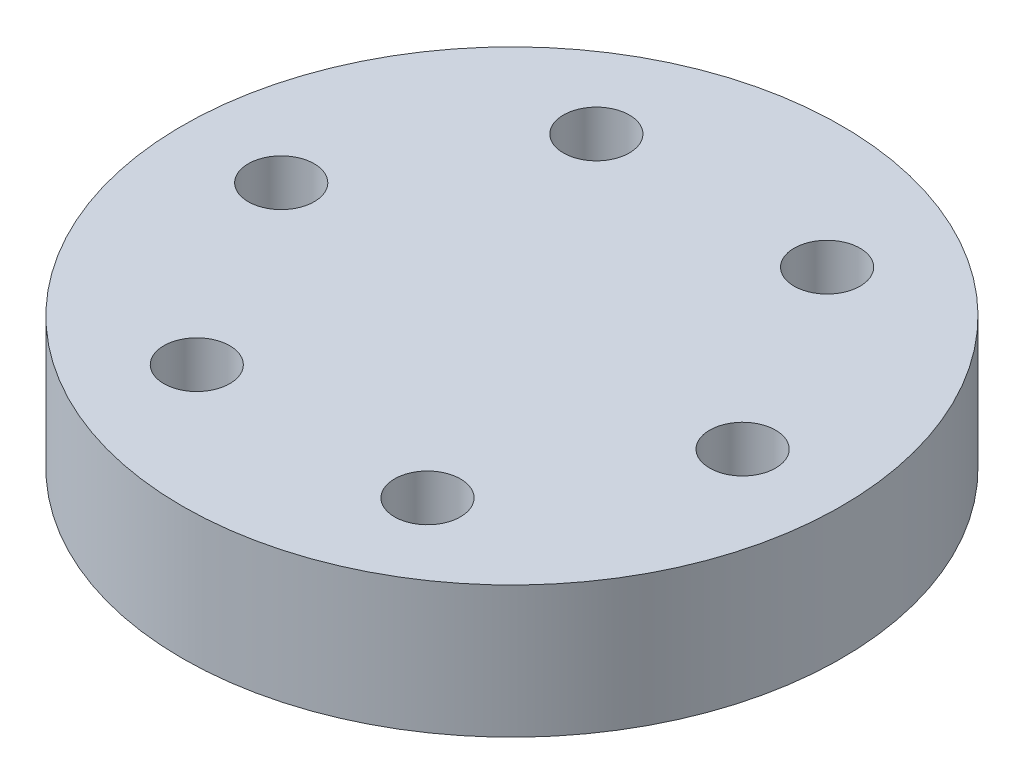
ISO-10303-21;
HEADER;
FILE_DESCRIPTION(('STEP AP214'),'2;1');
FILE_NAME('part.step','',(''),(''),'','','');
FILE_SCHEMA(('AUTOMOTIVE_DESIGN { 1 0 10303 214 1 1 1 1 }'));
ENDSEC;
DATA;
#1=APPLICATION_CONTEXT('core data for automotive mechanical design processes');
#2=APPLICATION_PROTOCOL_DEFINITION('international standard','automotive_design',2000,#1);
#3=PRODUCT_CONTEXT('',#1,'mechanical');
#4=PRODUCT('Part','Part','',(#3));
#5=PRODUCT_RELATED_PRODUCT_CATEGORY('part','',(#4));
#6=PRODUCT_DEFINITION_FORMATION('','',#4);
#7=PRODUCT_DEFINITION_CONTEXT('part definition',#1,'design');
#8=PRODUCT_DEFINITION('design','',#6,#7);
#9=PRODUCT_DEFINITION_SHAPE('','',#8);
#10=(LENGTH_UNIT() NAMED_UNIT(*) SI_UNIT(.MILLI.,.METRE.));
#11=(NAMED_UNIT(*) PLANE_ANGLE_UNIT() SI_UNIT($,.RADIAN.));
#12=(NAMED_UNIT(*) SI_UNIT($,.STERADIAN.) SOLID_ANGLE_UNIT());
#13=UNCERTAINTY_MEASURE_WITH_UNIT(LENGTH_MEASURE(1.E-05),#10,'distance_accuracy_value','');
#14=(GEOMETRIC_REPRESENTATION_CONTEXT(3) GLOBAL_UNCERTAINTY_ASSIGNED_CONTEXT((#13)) GLOBAL_UNIT_ASSIGNED_CONTEXT((#10,
#11,#12)) REPRESENTATION_CONTEXT('',''));
#15=CARTESIAN_POINT('',(0.,0.,0.));
#16=DIRECTION('',(0.,0.,1.));
#17=DIRECTION('',(1.,0.,0.));
#18=AXIS2_PLACEMENT_3D('',#15,#16,#17);
#19=CARTESIAN_POINT('',(0.,20.,0.));
#20=DIRECTION('',(0.,-1.,0.));
#21=DIRECTION('',(0.,0.,-1.));
#22=AXIS2_PLACEMENT_3D('',#19,#20,#21);
#23=CYLINDRICAL_SURFACE('',#22,50.);
#24=CARTESIAN_POINT('',(0.,20.,0.));
#25=DIRECTION('',(0.,1.,0.));
#26=DIRECTION('',(0.,0.,1.));
#27=AXIS2_PLACEMENT_3D('',#24,#25,#26);
#28=CIRCLE('',#27,50.);
#29=CARTESIAN_POINT('',(0.,20.,50.));
#30=VERTEX_POINT('',#29);
#31=EDGE_CURVE('E10',#30,#30,#28,.T.);
#32=ORIENTED_EDGE('',*,*,#31,.F.);
#33=EDGE_LOOP('',(#32));
#34=FACE_BOUND('',#33,.T.);
#35=CARTESIAN_POINT('',(0.,0.,0.));
#36=DIRECTION('',(0.,1.,0.));
#37=DIRECTION('',(0.,0.,1.));
#38=AXIS2_PLACEMENT_3D('',#35,#36,#37);
#39=CIRCLE('',#38,50.);
#40=CARTESIAN_POINT('',(0.,0.,50.));
#41=VERTEX_POINT('',#40);
#42=EDGE_CURVE('E34',#41,#41,#39,.T.);
#43=ORIENTED_EDGE('',*,*,#42,.T.);
#44=EDGE_LOOP('',(#43));
#45=FACE_BOUND('',#44,.T.);
#46=ADVANCED_FACE('F31',(#34,#45),#23,.T.);
#47=CARTESIAN_POINT('',(0.,20.,0.));
#48=DIRECTION('',(0.,1.,0.));
#49=DIRECTION('',(0.,0.,1.));
#50=AXIS2_PLACEMENT_3D('',#47,#48,#49);
#51=PLANE('',#50);
#52=CARTESIAN_POINT('',(-35.,20.,0.));
#53=DIRECTION('',(0.,1.,0.));
#54=DIRECTION('',(0.,0.,1.));
#55=AXIS2_PLACEMENT_3D('',#52,#53,#54);
#56=CIRCLE('',#55,5.);
#57=CARTESIAN_POINT('',(-35.,20.,5.));
#58=VERTEX_POINT('',#57);
#59=EDGE_CURVE('E68',#58,#58,#56,.T.);
#60=ORIENTED_EDGE('',*,*,#59,.F.);
#61=EDGE_LOOP('',(#60));
#62=FACE_BOUND('',#61,.T.);
#63=CARTESIAN_POINT('',(-17.5,20.,-30.3108891324554));
#64=DIRECTION('',(0.,1.,0.));
#65=DIRECTION('',(0.,0.,1.));
#66=AXIS2_PLACEMENT_3D('',#63,#64,#65);
#67=CIRCLE('',#66,5.);
#68=CARTESIAN_POINT('',(-17.5,20.,-25.3108891324554));
#69=VERTEX_POINT('',#68);
#70=EDGE_CURVE('E69',#69,#69,#67,.T.);
#71=ORIENTED_EDGE('',*,*,#70,.F.);
#72=EDGE_LOOP('',(#71));
#73=FACE_BOUND('',#72,.T.);
#74=CARTESIAN_POINT('',(17.5,20.,-30.3108891324554));
#75=DIRECTION('',(0.,1.,0.));
#76=DIRECTION('',(0.,0.,1.));
#77=AXIS2_PLACEMENT_3D('',#74,#75,#76);
#78=CIRCLE('',#77,5.00000000000001);
#79=CARTESIAN_POINT('',(17.5,20.,-25.3108891324554));
#80=VERTEX_POINT('',#79);
#81=EDGE_CURVE('E43',#80,#80,#78,.T.);
#82=ORIENTED_EDGE('',*,*,#81,.F.);
#83=EDGE_LOOP('',(#82));
#84=FACE_BOUND('',#83,.T.);
#85=CARTESIAN_POINT('',(35.,20.,0.));
#86=DIRECTION('',(0.,1.,0.));
#87=DIRECTION('',(0.,0.,1.));
#88=AXIS2_PLACEMENT_3D('',#85,#86,#87);
#89=CIRCLE('',#88,5.);
#90=CARTESIAN_POINT('',(35.,20.,4.99999999999999));
#91=VERTEX_POINT('',#90);
#92=EDGE_CURVE('E50',#91,#91,#89,.T.);
#93=ORIENTED_EDGE('',*,*,#92,.F.);
#94=EDGE_LOOP('',(#93));
#95=FACE_BOUND('',#94,.T.);
#96=CARTESIAN_POINT('',(17.5,20.,30.3108891324554));
#97=DIRECTION('',(0.,1.,0.));
#98=DIRECTION('',(0.,0.,1.));
#99=AXIS2_PLACEMENT_3D('',#96,#97,#98);
#100=CIRCLE('',#99,5.);
#101=CARTESIAN_POINT('',(17.5,20.,35.3108891324554));
#102=VERTEX_POINT('',#101);
#103=EDGE_CURVE('E56',#102,#102,#100,.T.);
#104=ORIENTED_EDGE('',*,*,#103,.F.);
#105=EDGE_LOOP('',(#104));
#106=FACE_BOUND('',#105,.T.);
#107=CARTESIAN_POINT('',(-17.5,20.,30.3108891324554));
#108=DIRECTION('',(0.,1.,0.));
#109=DIRECTION('',(0.,0.,1.));
#110=AXIS2_PLACEMENT_3D('',#107,#108,#109);
#111=CIRCLE('',#110,5.);
#112=CARTESIAN_POINT('',(-17.5,20.,35.3108891324554));
#113=VERTEX_POINT('',#112);
#114=EDGE_CURVE('E62',#113,#113,#111,.T.);
#115=ORIENTED_EDGE('',*,*,#114,.F.);
#116=EDGE_LOOP('',(#115));
#117=FACE_BOUND('',#116,.T.);
#118=ORIENTED_EDGE('',*,*,#31,.T.);
#119=EDGE_LOOP('',(#118));
#120=FACE_BOUND('',#119,.T.);
#121=ADVANCED_FACE('F88',(#62,#73,#84,#95,#106,#117,#120),#51,.T.);
#122=CARTESIAN_POINT('',(0.,0.,0.));
#123=DIRECTION('',(0.,1.,0.));
#124=DIRECTION('',(0.,0.,1.));
#125=AXIS2_PLACEMENT_3D('',#122,#123,#124);
#126=PLANE('',#125);
#127=ORIENTED_EDGE('',*,*,#42,.F.);
#128=EDGE_LOOP('',(#127));
#129=FACE_BOUND('',#128,.T.);
#130=ADVANCED_FACE('F91',(#129),#126,.F.);
#131=CARTESIAN_POINT('',(-17.5,10.,30.3108891324554));
#132=DIRECTION('',(0.,1.,0.));
#133=DIRECTION('',(0.,0.,1.));
#134=AXIS2_PLACEMENT_3D('',#131,#132,#133);
#135=CYLINDRICAL_SURFACE('',#134,5.);
#136=CARTESIAN_POINT('',(-17.5,10.,30.3108891324554));
#137=DIRECTION('',(0.,1.,0.));
#138=DIRECTION('',(0.,0.,1.));
#139=AXIS2_PLACEMENT_3D('',#136,#137,#138);
#140=CIRCLE('',#139,5.);
#141=CARTESIAN_POINT('',(-17.5,10.,35.3108891324554));
#142=VERTEX_POINT('',#141);
#143=EDGE_CURVE('E65',#142,#142,#140,.T.);
#144=CARTESIAN_POINT('',(-17.5,10.,35.3108891324554));
#145=CARTESIAN_POINT('',(-17.5,10.1041666666667,35.3108891324554));
#146=CARTESIAN_POINT('',(-17.5,10.2083333333333,35.3108891324554));
#147=CARTESIAN_POINT('',(-17.5,10.4166666666667,35.3108891324554));
#148=CARTESIAN_POINT('',(-17.5,10.5208333333333,35.3108891324554));
#149=CARTESIAN_POINT('',(-17.5,10.7291666666667,35.3108891324554));
#150=CARTESIAN_POINT('',(-17.5,10.8333333333333,35.3108891324554));
#151=CARTESIAN_POINT('',(-17.5,11.0416666666667,35.3108891324554));
#152=CARTESIAN_POINT('',(-17.5,11.1458333333333,35.3108891324554));
#153=CARTESIAN_POINT('',(-17.5,11.3541666666667,35.3108891324554));
#154=CARTESIAN_POINT('',(-17.5,11.4583333333333,35.3108891324554));
#155=CARTESIAN_POINT('',(-17.5,11.6666666666667,35.3108891324554));
#156=CARTESIAN_POINT('',(-17.5,11.7708333333333,35.3108891324554));
#157=CARTESIAN_POINT('',(-17.5,11.9791666666667,35.3108891324554));
#158=CARTESIAN_POINT('',(-17.5,12.0833333333333,35.3108891324554));
#159=CARTESIAN_POINT('',(-17.5,12.2916666666667,35.3108891324554));
#160=CARTESIAN_POINT('',(-17.5,12.3958333333333,35.3108891324554));
#161=CARTESIAN_POINT('',(-17.5,12.6041666666667,35.3108891324554));
#162=CARTESIAN_POINT('',(-17.5,12.7083333333333,35.3108891324554));
#163=CARTESIAN_POINT('',(-17.5,12.9166666666667,35.3108891324554));
#164=CARTESIAN_POINT('',(-17.5,13.0208333333333,35.3108891324554));
#165=CARTESIAN_POINT('',(-17.5,13.2291666666667,35.3108891324554));
#166=CARTESIAN_POINT('',(-17.5,13.3333333333333,35.3108891324554));
#167=CARTESIAN_POINT('',(-17.5,13.5416666666667,35.3108891324554));
#168=CARTESIAN_POINT('',(-17.5,13.6458333333333,35.3108891324554));
#169=CARTESIAN_POINT('',(-17.5,13.8541666666667,35.3108891324554));
#170=CARTESIAN_POINT('',(-17.5,13.9583333333333,35.3108891324554));
#171=CARTESIAN_POINT('',(-17.5,14.1666666666667,35.3108891324554));
#172=CARTESIAN_POINT('',(-17.5,14.2708333333333,35.3108891324554));
#173=CARTESIAN_POINT('',(-17.5,14.4791666666667,35.3108891324554));
#174=CARTESIAN_POINT('',(-17.5,14.5833333333333,35.3108891324554));
#175=CARTESIAN_POINT('',(-17.5,14.7916666666667,35.3108891324554));
#176=CARTESIAN_POINT('',(-17.5,14.8958333333333,35.3108891324554));
#177=CARTESIAN_POINT('',(-17.5,15.1041666666667,35.3108891324554));
#178=CARTESIAN_POINT('',(-17.5,15.2083333333333,35.3108891324554));
#179=CARTESIAN_POINT('',(-17.5,15.4166666666667,35.3108891324554));
#180=CARTESIAN_POINT('',(-17.5,15.5208333333333,35.3108891324554));
#181=CARTESIAN_POINT('',(-17.5,15.7291666666667,35.3108891324554));
#182=CARTESIAN_POINT('',(-17.5,15.8333333333333,35.3108891324554));
#183=CARTESIAN_POINT('',(-17.5,16.0416666666667,35.3108891324554));
#184=CARTESIAN_POINT('',(-17.5,16.1458333333333,35.3108891324554));
#185=CARTESIAN_POINT('',(-17.5,16.3541666666667,35.3108891324554));
#186=CARTESIAN_POINT('',(-17.5,16.4583333333333,35.3108891324554));
#187=CARTESIAN_POINT('',(-17.5,16.6666666666667,35.3108891324554));
#188=CARTESIAN_POINT('',(-17.5,16.7708333333333,35.3108891324554));
#189=CARTESIAN_POINT('',(-17.5,16.9791666666667,35.3108891324554));
#190=CARTESIAN_POINT('',(-17.5,17.0833333333333,35.3108891324554));
#191=CARTESIAN_POINT('',(-17.5,17.2916666666667,35.3108891324554));
#192=CARTESIAN_POINT('',(-17.5,17.3958333333333,35.3108891324554));
#193=CARTESIAN_POINT('',(-17.5,17.6041666666667,35.3108891324554));
#194=CARTESIAN_POINT('',(-17.5,17.7083333333333,35.3108891324554));
#195=CARTESIAN_POINT('',(-17.5,17.9166666666667,35.3108891324554));
#196=CARTESIAN_POINT('',(-17.5,18.0208333333333,35.3108891324554));
#197=CARTESIAN_POINT('',(-17.5,18.2291666666667,35.3108891324554));
#198=CARTESIAN_POINT('',(-17.5,18.3333333333333,35.3108891324554));
#199=CARTESIAN_POINT('',(-17.5,18.5416666666667,35.3108891324554));
#200=CARTESIAN_POINT('',(-17.5,18.6458333333333,35.3108891324554));
#201=CARTESIAN_POINT('',(-17.5,18.8541666666667,35.3108891324554));
#202=CARTESIAN_POINT('',(-17.5,18.9583333333333,35.3108891324554));
#203=CARTESIAN_POINT('',(-17.5,19.1666666666667,35.3108891324554));
#204=CARTESIAN_POINT('',(-17.5,19.2708333333333,35.3108891324554));
#205=CARTESIAN_POINT('',(-17.5,19.4791666666667,35.3108891324554));
#206=CARTESIAN_POINT('',(-17.5,19.5833333333333,35.3108891324554));
#207=CARTESIAN_POINT('',(-17.5,19.7916666666667,35.3108891324554));
#208=CARTESIAN_POINT('',(-17.5,19.8958333333333,35.3108891324554));
#209=CARTESIAN_POINT('',(-17.5,20.,35.3108891324554));
#210=B_SPLINE_CURVE_WITH_KNOTS('',3,(#144,#145,#146,#147,#148,#149,#150,#151,#152,#153,#154,
#155,#156,#157,#158,#159,#160,#161,#162,#163,#164,#165,#166,#167,#168,#169,#170,#171,#172,#173,
#174,#175,#176,#177,#178,#179,#180,#181,#182,#183,#184,#185,#186,#187,#188,#189,#190,#191,#192,
#193,#194,#195,#196,#197,#198,#199,#200,#201,#202,#203,#204,#205,#206,#207,#208,#209),
.UNSPECIFIED.,.F.,.F.,(4,2,2,2,2,2,2,2,2,2,2,2,2,2,2,2,2,2,2,2,2,2,2,2,2,2,2,2,2,2,2,2,4),(0.,
0.3125,0.625000000000001,0.937500000000001,1.25,1.5625,1.875,2.1875,2.5,2.8125,3.125,3.4375,
3.75,4.0625,4.375,4.6875,5.,5.3125,5.625,5.9375,6.25,6.5625,6.875,7.1875,7.5,7.8125,8.125,
8.4375,8.75,9.0625,9.375,9.6875,10.),.UNSPECIFIED.);
#211=EDGE_CURVE('BSEAM103',#142,#113,#210,.T.);
#212=ORIENTED_EDGE('',*,*,#143,.F.);
#213=ORIENTED_EDGE('',*,*,#114,.T.);
#214=ORIENTED_EDGE('',*,*,#211,.T.);
#215=ORIENTED_EDGE('',*,*,#211,.F.);
#216=EDGE_LOOP('',(#212,#214,#213,#215));
#217=FACE_BOUND('',#216,.T.);
#218=ADVANCED_FACE('F103',(#217),#135,.F.);
#219=CARTESIAN_POINT('',(0.,10.,0.));
#220=DIRECTION('',(0.,1.,0.));
#221=DIRECTION('',(0.,0.,1.));
#222=AXIS2_PLACEMENT_3D('',#219,#220,#221);
#223=PLANE('',#222);
#224=ORIENTED_EDGE('',*,*,#143,.T.);
#225=EDGE_LOOP('',(#224));
#226=FACE_BOUND('',#225,.T.);
#227=ADVANCED_FACE('F105',(#226),#223,.T.);
#228=CARTESIAN_POINT('',(17.5,10.,30.3108891324554));
#229=DIRECTION('',(0.,1.,0.));
#230=DIRECTION('',(0.,0.,1.));
#231=AXIS2_PLACEMENT_3D('',#228,#229,#230);
#232=CYLINDRICAL_SURFACE('',#231,5.);
#233=CARTESIAN_POINT('',(17.5,10.,30.3108891324554));
#234=DIRECTION('',(0.,1.,0.));
#235=DIRECTION('',(0.,0.,1.));
#236=AXIS2_PLACEMENT_3D('',#233,#234,#235);
#237=CIRCLE('',#236,5.);
#238=CARTESIAN_POINT('',(17.5,10.,35.3108891324554));
#239=VERTEX_POINT('',#238);
#240=EDGE_CURVE('E59',#239,#239,#237,.T.);
#241=CARTESIAN_POINT('',(17.5,10.,35.3108891324554));
#242=CARTESIAN_POINT('',(17.5,10.1041666666667,35.3108891324554));
#243=CARTESIAN_POINT('',(17.5,10.2083333333333,35.3108891324554));
#244=CARTESIAN_POINT('',(17.5,10.4166666666667,35.3108891324554));
#245=CARTESIAN_POINT('',(17.5,10.5208333333333,35.3108891324554));
#246=CARTESIAN_POINT('',(17.5,10.7291666666667,35.3108891324554));
#247=CARTESIAN_POINT('',(17.5,10.8333333333333,35.3108891324554));
#248=CARTESIAN_POINT('',(17.5,11.0416666666667,35.3108891324554));
#249=CARTESIAN_POINT('',(17.5,11.1458333333333,35.3108891324554));
#250=CARTESIAN_POINT('',(17.5,11.3541666666667,35.3108891324554));
#251=CARTESIAN_POINT('',(17.5,11.4583333333333,35.3108891324554));
#252=CARTESIAN_POINT('',(17.5,11.6666666666667,35.3108891324554));
#253=CARTESIAN_POINT('',(17.5,11.7708333333333,35.3108891324554));
#254=CARTESIAN_POINT('',(17.5,11.9791666666667,35.3108891324554));
#255=CARTESIAN_POINT('',(17.5,12.0833333333333,35.3108891324554));
#256=CARTESIAN_POINT('',(17.5,12.2916666666667,35.3108891324554));
#257=CARTESIAN_POINT('',(17.5,12.3958333333333,35.3108891324554));
#258=CARTESIAN_POINT('',(17.5,12.6041666666667,35.3108891324554));
#259=CARTESIAN_POINT('',(17.5,12.7083333333333,35.3108891324554));
#260=CARTESIAN_POINT('',(17.5,12.9166666666667,35.3108891324554));
#261=CARTESIAN_POINT('',(17.5,13.0208333333333,35.3108891324554));
#262=CARTESIAN_POINT('',(17.5,13.2291666666667,35.3108891324554));
#263=CARTESIAN_POINT('',(17.5,13.3333333333333,35.3108891324554));
#264=CARTESIAN_POINT('',(17.5,13.5416666666667,35.3108891324554));
#265=CARTESIAN_POINT('',(17.5,13.6458333333333,35.3108891324554));
#266=CARTESIAN_POINT('',(17.5,13.8541666666667,35.3108891324554));
#267=CARTESIAN_POINT('',(17.5,13.9583333333333,35.3108891324554));
#268=CARTESIAN_POINT('',(17.5,14.1666666666667,35.3108891324554));
#269=CARTESIAN_POINT('',(17.5,14.2708333333333,35.3108891324554));
#270=CARTESIAN_POINT('',(17.5,14.4791666666667,35.3108891324554));
#271=CARTESIAN_POINT('',(17.5,14.5833333333333,35.3108891324554));
#272=CARTESIAN_POINT('',(17.5,14.7916666666667,35.3108891324554));
#273=CARTESIAN_POINT('',(17.5,14.8958333333333,35.3108891324554));
#274=CARTESIAN_POINT('',(17.5,15.1041666666667,35.3108891324554));
#275=CARTESIAN_POINT('',(17.5,15.2083333333333,35.3108891324554));
#276=CARTESIAN_POINT('',(17.5,15.4166666666667,35.3108891324554));
#277=CARTESIAN_POINT('',(17.5,15.5208333333333,35.3108891324554));
#278=CARTESIAN_POINT('',(17.5,15.7291666666667,35.3108891324554));
#279=CARTESIAN_POINT('',(17.5,15.8333333333333,35.3108891324554));
#280=CARTESIAN_POINT('',(17.5,16.0416666666667,35.3108891324554));
#281=CARTESIAN_POINT('',(17.5,16.1458333333333,35.3108891324554));
#282=CARTESIAN_POINT('',(17.5,16.3541666666667,35.3108891324554));
#283=CARTESIAN_POINT('',(17.5,16.4583333333333,35.3108891324554));
#284=CARTESIAN_POINT('',(17.5,16.6666666666667,35.3108891324554));
#285=CARTESIAN_POINT('',(17.5,16.7708333333333,35.3108891324554));
#286=CARTESIAN_POINT('',(17.5,16.9791666666667,35.3108891324554));
#287=CARTESIAN_POINT('',(17.5,17.0833333333333,35.3108891324554));
#288=CARTESIAN_POINT('',(17.5,17.2916666666667,35.3108891324554));
#289=CARTESIAN_POINT('',(17.5,17.3958333333333,35.3108891324554));
#290=CARTESIAN_POINT('',(17.5,17.6041666666667,35.3108891324554));
#291=CARTESIAN_POINT('',(17.5,17.7083333333333,35.3108891324554));
#292=CARTESIAN_POINT('',(17.5,17.9166666666667,35.3108891324554));
#293=CARTESIAN_POINT('',(17.5,18.0208333333333,35.3108891324554));
#294=CARTESIAN_POINT('',(17.5,18.2291666666667,35.3108891324554));
#295=CARTESIAN_POINT('',(17.5,18.3333333333333,35.3108891324554));
#296=CARTESIAN_POINT('',(17.5,18.5416666666667,35.3108891324554));
#297=CARTESIAN_POINT('',(17.5,18.6458333333333,35.3108891324554));
#298=CARTESIAN_POINT('',(17.5,18.8541666666667,35.3108891324554));
#299=CARTESIAN_POINT('',(17.5,18.9583333333333,35.3108891324554));
#300=CARTESIAN_POINT('',(17.5,19.1666666666667,35.3108891324554));
#301=CARTESIAN_POINT('',(17.5,19.2708333333333,35.3108891324554));
#302=CARTESIAN_POINT('',(17.5,19.4791666666667,35.3108891324554));
#303=CARTESIAN_POINT('',(17.5,19.5833333333333,35.3108891324554));
#304=CARTESIAN_POINT('',(17.5,19.7916666666667,35.3108891324554));
#305=CARTESIAN_POINT('',(17.5,19.8958333333333,35.3108891324554));
#306=CARTESIAN_POINT('',(17.5,20.,35.3108891324554));
#307=B_SPLINE_CURVE_WITH_KNOTS('',3,(#241,#242,#243,#244,#245,#246,#247,#248,#249,#250,#251,
#252,#253,#254,#255,#256,#257,#258,#259,#260,#261,#262,#263,#264,#265,#266,#267,#268,#269,#270,
#271,#272,#273,#274,#275,#276,#277,#278,#279,#280,#281,#282,#283,#284,#285,#286,#287,#288,#289,
#290,#291,#292,#293,#294,#295,#296,#297,#298,#299,#300,#301,#302,#303,#304,#305,#306),
.UNSPECIFIED.,.F.,.F.,(4,2,2,2,2,2,2,2,2,2,2,2,2,2,2,2,2,2,2,2,2,2,2,2,2,2,2,2,2,2,2,2,4),(0.,
0.3125,0.625000000000001,0.937500000000001,1.25,1.5625,1.875,2.1875,2.5,2.8125,3.125,3.4375,
3.75,4.0625,4.375,4.6875,5.,5.3125,5.625,5.9375,6.25,6.5625,6.875,7.1875,7.5,7.8125,8.125,
8.4375,8.75,9.0625,9.375,9.6875,10.),.UNSPECIFIED.);
#308=EDGE_CURVE('BSEAM112',#239,#102,#307,.T.);
#309=ORIENTED_EDGE('',*,*,#240,.F.);
#310=ORIENTED_EDGE('',*,*,#103,.T.);
#311=ORIENTED_EDGE('',*,*,#308,.T.);
#312=ORIENTED_EDGE('',*,*,#308,.F.);
#313=EDGE_LOOP('',(#309,#311,#310,#312));
#314=FACE_BOUND('',#313,.T.);
#315=ADVANCED_FACE('F112',(#314),#232,.F.);
#316=CARTESIAN_POINT('',(0.,10.,0.));
#317=DIRECTION('',(0.,1.,0.));
#318=DIRECTION('',(0.,0.,1.));
#319=AXIS2_PLACEMENT_3D('',#316,#317,#318);
#320=PLANE('',#319);
#321=ORIENTED_EDGE('',*,*,#240,.T.);
#322=EDGE_LOOP('',(#321));
#323=FACE_BOUND('',#322,.T.);
#324=ADVANCED_FACE('F156',(#323),#320,.T.);
#325=CARTESIAN_POINT('',(35.,10.,0.));
#326=DIRECTION('',(0.,1.,0.));
#327=DIRECTION('',(0.,0.,1.));
#328=AXIS2_PLACEMENT_3D('',#325,#326,#327);
#329=CYLINDRICAL_SURFACE('',#328,5.);
#330=CARTESIAN_POINT('',(35.,10.,0.));
#331=DIRECTION('',(0.,1.,0.));
#332=DIRECTION('',(0.,0.,1.));
#333=AXIS2_PLACEMENT_3D('',#330,#331,#332);
#334=CIRCLE('',#333,5.);
#335=CARTESIAN_POINT('',(35.,10.,4.99999999999999));
#336=VERTEX_POINT('',#335);
#337=EDGE_CURVE('E53',#336,#336,#334,.T.);
#338=CARTESIAN_POINT('',(35.,10.,4.99999999999999));
#339=CARTESIAN_POINT('',(35.,10.1041666666667,4.99999999999999));
#340=CARTESIAN_POINT('',(35.,10.2083333333333,4.99999999999999));
#341=CARTESIAN_POINT('',(35.,10.4166666666667,4.99999999999999));
#342=CARTESIAN_POINT('',(35.,10.5208333333333,4.99999999999999));
#343=CARTESIAN_POINT('',(35.,10.7291666666667,4.99999999999999));
#344=CARTESIAN_POINT('',(35.,10.8333333333333,4.99999999999999));
#345=CARTESIAN_POINT('',(35.,11.0416666666667,4.99999999999999));
#346=CARTESIAN_POINT('',(35.,11.1458333333333,4.99999999999999));
#347=CARTESIAN_POINT('',(35.,11.3541666666667,4.99999999999999));
#348=CARTESIAN_POINT('',(35.,11.4583333333333,4.99999999999999));
#349=CARTESIAN_POINT('',(35.,11.6666666666667,4.99999999999999));
#350=CARTESIAN_POINT('',(35.,11.7708333333333,4.99999999999999));
#351=CARTESIAN_POINT('',(35.,11.9791666666667,4.99999999999999));
#352=CARTESIAN_POINT('',(35.,12.0833333333333,4.99999999999999));
#353=CARTESIAN_POINT('',(35.,12.2916666666667,4.99999999999999));
#354=CARTESIAN_POINT('',(35.,12.3958333333333,4.99999999999999));
#355=CARTESIAN_POINT('',(35.,12.6041666666667,4.99999999999999));
#356=CARTESIAN_POINT('',(35.,12.7083333333333,4.99999999999999));
#357=CARTESIAN_POINT('',(35.,12.9166666666667,4.99999999999999));
#358=CARTESIAN_POINT('',(35.,13.0208333333333,4.99999999999999));
#359=CARTESIAN_POINT('',(35.,13.2291666666667,4.99999999999999));
#360=CARTESIAN_POINT('',(35.,13.3333333333333,4.99999999999999));
#361=CARTESIAN_POINT('',(35.,13.5416666666667,4.99999999999999));
#362=CARTESIAN_POINT('',(35.,13.6458333333333,4.99999999999999));
#363=CARTESIAN_POINT('',(35.,13.8541666666667,4.99999999999999));
#364=CARTESIAN_POINT('',(35.,13.9583333333333,4.99999999999999));
#365=CARTESIAN_POINT('',(35.,14.1666666666667,4.99999999999999));
#366=CARTESIAN_POINT('',(35.,14.2708333333333,4.99999999999999));
#367=CARTESIAN_POINT('',(35.,14.4791666666667,4.99999999999999));
#368=CARTESIAN_POINT('',(35.,14.5833333333333,4.99999999999999));
#369=CARTESIAN_POINT('',(35.,14.7916666666667,4.99999999999999));
#370=CARTESIAN_POINT('',(35.,14.8958333333333,4.99999999999999));
#371=CARTESIAN_POINT('',(35.,15.1041666666667,4.99999999999999));
#372=CARTESIAN_POINT('',(35.,15.2083333333333,4.99999999999999));
#373=CARTESIAN_POINT('',(35.,15.4166666666667,4.99999999999999));
#374=CARTESIAN_POINT('',(35.,15.5208333333333,4.99999999999999));
#375=CARTESIAN_POINT('',(35.,15.7291666666667,4.99999999999999));
#376=CARTESIAN_POINT('',(35.,15.8333333333333,4.99999999999999));
#377=CARTESIAN_POINT('',(35.,16.0416666666667,4.99999999999999));
#378=CARTESIAN_POINT('',(35.,16.1458333333333,4.99999999999999));
#379=CARTESIAN_POINT('',(35.,16.3541666666667,4.99999999999999));
#380=CARTESIAN_POINT('',(35.,16.4583333333333,4.99999999999999));
#381=CARTESIAN_POINT('',(35.,16.6666666666667,4.99999999999999));
#382=CARTESIAN_POINT('',(35.,16.7708333333333,4.99999999999999));
#383=CARTESIAN_POINT('',(35.,16.9791666666667,4.99999999999999));
#384=CARTESIAN_POINT('',(35.,17.0833333333333,4.99999999999999));
#385=CARTESIAN_POINT('',(35.,17.2916666666667,4.99999999999999));
#386=CARTESIAN_POINT('',(35.,17.3958333333333,4.99999999999999));
#387=CARTESIAN_POINT('',(35.,17.6041666666667,4.99999999999999));
#388=CARTESIAN_POINT('',(35.,17.7083333333333,4.99999999999999));
#389=CARTESIAN_POINT('',(35.,17.9166666666667,4.99999999999999));
#390=CARTESIAN_POINT('',(35.,18.0208333333333,4.99999999999999));
#391=CARTESIAN_POINT('',(35.,18.2291666666667,4.99999999999999));
#392=CARTESIAN_POINT('',(35.,18.3333333333333,4.99999999999999));
#393=CARTESIAN_POINT('',(35.,18.5416666666667,4.99999999999999));
#394=CARTESIAN_POINT('',(35.,18.6458333333333,4.99999999999999));
#395=CARTESIAN_POINT('',(35.,18.8541666666667,4.99999999999999));
#396=CARTESIAN_POINT('',(35.,18.9583333333333,4.99999999999999));
#397=CARTESIAN_POINT('',(35.,19.1666666666667,4.99999999999999));
#398=CARTESIAN_POINT('',(35.,19.2708333333333,4.99999999999999));
#399=CARTESIAN_POINT('',(35.,19.4791666666667,4.99999999999999));
#400=CARTESIAN_POINT('',(35.,19.5833333333333,4.99999999999999));
#401=CARTESIAN_POINT('',(35.,19.7916666666667,4.99999999999999));
#402=CARTESIAN_POINT('',(35.,19.8958333333333,4.99999999999999));
#403=CARTESIAN_POINT('',(35.,20.,4.99999999999999));
#404=B_SPLINE_CURVE_WITH_KNOTS('',3,(#338,#339,#340,#341,#342,#343,#344,#345,#346,#347,#348,
#349,#350,#351,#352,#353,#354,#355,#356,#357,#358,#359,#360,#361,#362,#363,#364,#365,#366,#367,
#368,#369,#370,#371,#372,#373,#374,#375,#376,#377,#378,#379,#380,#381,#382,#383,#384,#385,#386,
#387,#388,#389,#390,#391,#392,#393,#394,#395,#396,#397,#398,#399,#400,#401,#402,#403),
.UNSPECIFIED.,.F.,.F.,(4,2,2,2,2,2,2,2,2,2,2,2,2,2,2,2,2,2,2,2,2,2,2,2,2,2,2,2,2,2,2,2,4),(0.,
0.3125,0.625000000000001,0.937500000000001,1.25,1.5625,1.875,2.1875,2.5,2.8125,3.125,3.4375,
3.75,4.0625,4.375,4.6875,5.,5.3125,5.625,5.9375,6.25,6.5625,6.875,7.1875,7.5,7.8125,8.125,
8.4375,8.75,9.0625,9.375,9.6875,10.),.UNSPECIFIED.);
#405=EDGE_CURVE('BSEAM165',#336,#91,#404,.T.);
#406=ORIENTED_EDGE('',*,*,#337,.F.);
#407=ORIENTED_EDGE('',*,*,#92,.T.);
#408=ORIENTED_EDGE('',*,*,#405,.T.);
#409=ORIENTED_EDGE('',*,*,#405,.F.);
#410=EDGE_LOOP('',(#406,#408,#407,#409));
#411=FACE_BOUND('',#410,.T.);
#412=ADVANCED_FACE('F165',(#411),#329,.F.);
#413=CARTESIAN_POINT('',(0.,10.,0.));
#414=DIRECTION('',(0.,1.,0.));
#415=DIRECTION('',(0.,0.,1.));
#416=AXIS2_PLACEMENT_3D('',#413,#414,#415);
#417=PLANE('',#416);
#418=ORIENTED_EDGE('',*,*,#337,.T.);
#419=EDGE_LOOP('',(#418));
#420=FACE_BOUND('',#419,.T.);
#421=ADVANCED_FACE('F176',(#420),#417,.T.);
#422=CARTESIAN_POINT('',(17.5,10.,-30.3108891324554));
#423=DIRECTION('',(0.,1.,0.));
#424=DIRECTION('',(0.,0.,1.));
#425=AXIS2_PLACEMENT_3D('',#422,#423,#424);
#426=CYLINDRICAL_SURFACE('',#425,5.00000000000001);
#427=CARTESIAN_POINT('',(17.5,10.,-30.3108891324554));
#428=DIRECTION('',(0.,1.,0.));
#429=DIRECTION('',(0.,0.,1.));
#430=AXIS2_PLACEMENT_3D('',#427,#428,#429);
#431=CIRCLE('',#430,5.00000000000001);
#432=CARTESIAN_POINT('',(17.5,10.,-25.3108891324554));
#433=VERTEX_POINT('',#432);
#434=EDGE_CURVE('E46',#433,#433,#431,.T.);
#435=CARTESIAN_POINT('',(17.5,10.,-25.3108891324554));
#436=CARTESIAN_POINT('',(17.5,10.1041666666667,-25.3108891324554));
#437=CARTESIAN_POINT('',(17.5,10.2083333333333,-25.3108891324554));
#438=CARTESIAN_POINT('',(17.5,10.4166666666667,-25.3108891324554));
#439=CARTESIAN_POINT('',(17.5,10.5208333333333,-25.3108891324554));
#440=CARTESIAN_POINT('',(17.5,10.7291666666667,-25.3108891324554));
#441=CARTESIAN_POINT('',(17.5,10.8333333333333,-25.3108891324554));
#442=CARTESIAN_POINT('',(17.5,11.0416666666667,-25.3108891324554));
#443=CARTESIAN_POINT('',(17.5,11.1458333333333,-25.3108891324554));
#444=CARTESIAN_POINT('',(17.5,11.3541666666667,-25.3108891324554));
#445=CARTESIAN_POINT('',(17.5,11.4583333333333,-25.3108891324554));
#446=CARTESIAN_POINT('',(17.5,11.6666666666667,-25.3108891324554));
#447=CARTESIAN_POINT('',(17.5,11.7708333333333,-25.3108891324554));
#448=CARTESIAN_POINT('',(17.5,11.9791666666667,-25.3108891324554));
#449=CARTESIAN_POINT('',(17.5,12.0833333333333,-25.3108891324554));
#450=CARTESIAN_POINT('',(17.5,12.2916666666667,-25.3108891324554));
#451=CARTESIAN_POINT('',(17.5,12.3958333333333,-25.3108891324554));
#452=CARTESIAN_POINT('',(17.5,12.6041666666667,-25.3108891324554));
#453=CARTESIAN_POINT('',(17.5,12.7083333333333,-25.3108891324554));
#454=CARTESIAN_POINT('',(17.5,12.9166666666667,-25.3108891324554));
#455=CARTESIAN_POINT('',(17.5,13.0208333333333,-25.3108891324554));
#456=CARTESIAN_POINT('',(17.5,13.2291666666667,-25.3108891324554));
#457=CARTESIAN_POINT('',(17.5,13.3333333333333,-25.3108891324554));
#458=CARTESIAN_POINT('',(17.5,13.5416666666667,-25.3108891324554));
#459=CARTESIAN_POINT('',(17.5,13.6458333333333,-25.3108891324554));
#460=CARTESIAN_POINT('',(17.5,13.8541666666667,-25.3108891324554));
#461=CARTESIAN_POINT('',(17.5,13.9583333333333,-25.3108891324554));
#462=CARTESIAN_POINT('',(17.5,14.1666666666667,-25.3108891324554));
#463=CARTESIAN_POINT('',(17.5,14.2708333333333,-25.3108891324554));
#464=CARTESIAN_POINT('',(17.5,14.4791666666667,-25.3108891324554));
#465=CARTESIAN_POINT('',(17.5,14.5833333333333,-25.3108891324554));
#466=CARTESIAN_POINT('',(17.5,14.7916666666667,-25.3108891324554));
#467=CARTESIAN_POINT('',(17.5,14.8958333333333,-25.3108891324554));
#468=CARTESIAN_POINT('',(17.5,15.1041666666667,-25.3108891324554));
#469=CARTESIAN_POINT('',(17.5,15.2083333333333,-25.3108891324554));
#470=CARTESIAN_POINT('',(17.5,15.4166666666667,-25.3108891324554));
#471=CARTESIAN_POINT('',(17.5,15.5208333333333,-25.3108891324554));
#472=CARTESIAN_POINT('',(17.5,15.7291666666667,-25.3108891324554));
#473=CARTESIAN_POINT('',(17.5,15.8333333333333,-25.3108891324554));
#474=CARTESIAN_POINT('',(17.5,16.0416666666667,-25.3108891324554));
#475=CARTESIAN_POINT('',(17.5,16.1458333333333,-25.3108891324554));
#476=CARTESIAN_POINT('',(17.5,16.3541666666667,-25.3108891324554));
#477=CARTESIAN_POINT('',(17.5,16.4583333333333,-25.3108891324554));
#478=CARTESIAN_POINT('',(17.5,16.6666666666667,-25.3108891324554));
#479=CARTESIAN_POINT('',(17.5,16.7708333333333,-25.3108891324554));
#480=CARTESIAN_POINT('',(17.5,16.9791666666667,-25.3108891324554));
#481=CARTESIAN_POINT('',(17.5,17.0833333333333,-25.3108891324554));
#482=CARTESIAN_POINT('',(17.5,17.2916666666667,-25.3108891324554));
#483=CARTESIAN_POINT('',(17.5,17.3958333333333,-25.3108891324554));
#484=CARTESIAN_POINT('',(17.5,17.6041666666667,-25.3108891324554));
#485=CARTESIAN_POINT('',(17.5,17.7083333333333,-25.3108891324554));
#486=CARTESIAN_POINT('',(17.5,17.9166666666667,-25.3108891324554));
#487=CARTESIAN_POINT('',(17.5,18.0208333333333,-25.3108891324554));
#488=CARTESIAN_POINT('',(17.5,18.2291666666667,-25.3108891324554));
#489=CARTESIAN_POINT('',(17.5,18.3333333333333,-25.3108891324554));
#490=CARTESIAN_POINT('',(17.5,18.5416666666667,-25.3108891324554));
#491=CARTESIAN_POINT('',(17.5,18.6458333333333,-25.3108891324554));
#492=CARTESIAN_POINT('',(17.5,18.8541666666667,-25.3108891324554));
#493=CARTESIAN_POINT('',(17.5,18.9583333333333,-25.3108891324554));
#494=CARTESIAN_POINT('',(17.5,19.1666666666667,-25.3108891324554));
#495=CARTESIAN_POINT('',(17.5,19.2708333333333,-25.3108891324554));
#496=CARTESIAN_POINT('',(17.5,19.4791666666667,-25.3108891324554));
#497=CARTESIAN_POINT('',(17.5,19.5833333333333,-25.3108891324554));
#498=CARTESIAN_POINT('',(17.5,19.7916666666667,-25.3108891324554));
#499=CARTESIAN_POINT('',(17.5,19.8958333333333,-25.3108891324554));
#500=CARTESIAN_POINT('',(17.5,20.,-25.3108891324554));
#501=B_SPLINE_CURVE_WITH_KNOTS('',3,(#435,#436,#437,#438,#439,#440,#441,#442,#443,#444,#445,
#446,#447,#448,#449,#450,#451,#452,#453,#454,#455,#456,#457,#458,#459,#460,#461,#462,#463,#464,
#465,#466,#467,#468,#469,#470,#471,#472,#473,#474,#475,#476,#477,#478,#479,#480,#481,#482,#483,
#484,#485,#486,#487,#488,#489,#490,#491,#492,#493,#494,#495,#496,#497,#498,#499,#500),
.UNSPECIFIED.,.F.,.F.,(4,2,2,2,2,2,2,2,2,2,2,2,2,2,2,2,2,2,2,2,2,2,2,2,2,2,2,2,2,2,2,2,4),(0.,
0.3125,0.625000000000001,0.937500000000001,1.25,1.5625,1.875,2.1875,2.5,2.8125,3.125,3.4375,
3.75,4.0625,4.375,4.6875,5.,5.3125,5.625,5.9375,6.25,6.5625,6.875,7.1875,7.5,7.8125,8.125,
8.4375,8.75,9.0625,9.375,9.6875,10.),.UNSPECIFIED.);
#502=EDGE_CURVE('BSEAM185',#433,#80,#501,.T.);
#503=ORIENTED_EDGE('',*,*,#434,.F.);
#504=ORIENTED_EDGE('',*,*,#81,.T.);
#505=ORIENTED_EDGE('',*,*,#502,.T.);
#506=ORIENTED_EDGE('',*,*,#502,.F.);
#507=EDGE_LOOP('',(#503,#505,#504,#506));
#508=FACE_BOUND('',#507,.T.);
#509=ADVANCED_FACE('F185',(#508),#426,.F.);
#510=CARTESIAN_POINT('',(0.,10.,0.));
#511=DIRECTION('',(0.,1.,0.));
#512=DIRECTION('',(0.,0.,1.));
#513=AXIS2_PLACEMENT_3D('',#510,#511,#512);
#514=PLANE('',#513);
#515=ORIENTED_EDGE('',*,*,#434,.T.);
#516=EDGE_LOOP('',(#515));
#517=FACE_BOUND('',#516,.T.);
#518=ADVANCED_FACE('F197',(#517),#514,.T.);
#519=CARTESIAN_POINT('',(-17.5,10.,-30.3108891324554));
#520=DIRECTION('',(0.,1.,0.));
#521=DIRECTION('',(0.,0.,1.));
#522=AXIS2_PLACEMENT_3D('',#519,#520,#521);
#523=CYLINDRICAL_SURFACE('',#522,5.);
#524=CARTESIAN_POINT('',(-17.5,10.,-30.3108891324554));
#525=DIRECTION('',(0.,1.,0.));
#526=DIRECTION('',(0.,0.,1.));
#527=AXIS2_PLACEMENT_3D('',#524,#525,#526);
#528=CIRCLE('',#527,5.);
#529=CARTESIAN_POINT('',(-17.5,10.,-25.3108891324554));
#530=VERTEX_POINT('',#529);
#531=EDGE_CURVE('E47',#530,#530,#528,.T.);
#532=CARTESIAN_POINT('',(-17.5,10.,-25.3108891324554));
#533=CARTESIAN_POINT('',(-17.5,10.1041666666667,-25.3108891324554));
#534=CARTESIAN_POINT('',(-17.5,10.2083333333333,-25.3108891324554));
#535=CARTESIAN_POINT('',(-17.5,10.4166666666667,-25.3108891324554));
#536=CARTESIAN_POINT('',(-17.5,10.5208333333333,-25.3108891324554));
#537=CARTESIAN_POINT('',(-17.5,10.7291666666667,-25.3108891324554));
#538=CARTESIAN_POINT('',(-17.5,10.8333333333333,-25.3108891324554));
#539=CARTESIAN_POINT('',(-17.5,11.0416666666667,-25.3108891324554));
#540=CARTESIAN_POINT('',(-17.5,11.1458333333333,-25.3108891324554));
#541=CARTESIAN_POINT('',(-17.5,11.3541666666667,-25.3108891324554));
#542=CARTESIAN_POINT('',(-17.5,11.4583333333333,-25.3108891324554));
#543=CARTESIAN_POINT('',(-17.5,11.6666666666667,-25.3108891324554));
#544=CARTESIAN_POINT('',(-17.5,11.7708333333333,-25.3108891324554));
#545=CARTESIAN_POINT('',(-17.5,11.9791666666667,-25.3108891324554));
#546=CARTESIAN_POINT('',(-17.5,12.0833333333333,-25.3108891324554));
#547=CARTESIAN_POINT('',(-17.5,12.2916666666667,-25.3108891324554));
#548=CARTESIAN_POINT('',(-17.5,12.3958333333333,-25.3108891324554));
#549=CARTESIAN_POINT('',(-17.5,12.6041666666667,-25.3108891324554));
#550=CARTESIAN_POINT('',(-17.5,12.7083333333333,-25.3108891324554));
#551=CARTESIAN_POINT('',(-17.5,12.9166666666667,-25.3108891324554));
#552=CARTESIAN_POINT('',(-17.5,13.0208333333333,-25.3108891324554));
#553=CARTESIAN_POINT('',(-17.5,13.2291666666667,-25.3108891324554));
#554=CARTESIAN_POINT('',(-17.5,13.3333333333333,-25.3108891324554));
#555=CARTESIAN_POINT('',(-17.5,13.5416666666667,-25.3108891324554));
#556=CARTESIAN_POINT('',(-17.5,13.6458333333333,-25.3108891324554));
#557=CARTESIAN_POINT('',(-17.5,13.8541666666667,-25.3108891324554));
#558=CARTESIAN_POINT('',(-17.5,13.9583333333333,-25.3108891324554));
#559=CARTESIAN_POINT('',(-17.5,14.1666666666667,-25.3108891324554));
#560=CARTESIAN_POINT('',(-17.5,14.2708333333333,-25.3108891324554));
#561=CARTESIAN_POINT('',(-17.5,14.4791666666667,-25.3108891324554));
#562=CARTESIAN_POINT('',(-17.5,14.5833333333333,-25.3108891324554));
#563=CARTESIAN_POINT('',(-17.5,14.7916666666667,-25.3108891324554));
#564=CARTESIAN_POINT('',(-17.5,14.8958333333333,-25.3108891324554));
#565=CARTESIAN_POINT('',(-17.5,15.1041666666667,-25.3108891324554));
#566=CARTESIAN_POINT('',(-17.5,15.2083333333333,-25.3108891324554));
#567=CARTESIAN_POINT('',(-17.5,15.4166666666667,-25.3108891324554));
#568=CARTESIAN_POINT('',(-17.5,15.5208333333333,-25.3108891324554));
#569=CARTESIAN_POINT('',(-17.5,15.7291666666667,-25.3108891324554));
#570=CARTESIAN_POINT('',(-17.5,15.8333333333333,-25.3108891324554));
#571=CARTESIAN_POINT('',(-17.5,16.0416666666667,-25.3108891324554));
#572=CARTESIAN_POINT('',(-17.5,16.1458333333333,-25.3108891324554));
#573=CARTESIAN_POINT('',(-17.5,16.3541666666667,-25.3108891324554));
#574=CARTESIAN_POINT('',(-17.5,16.4583333333333,-25.3108891324554));
#575=CARTESIAN_POINT('',(-17.5,16.6666666666667,-25.3108891324554));
#576=CARTESIAN_POINT('',(-17.5,16.7708333333333,-25.3108891324554));
#577=CARTESIAN_POINT('',(-17.5,16.9791666666667,-25.3108891324554));
#578=CARTESIAN_POINT('',(-17.5,17.0833333333333,-25.3108891324554));
#579=CARTESIAN_POINT('',(-17.5,17.2916666666667,-25.3108891324554));
#580=CARTESIAN_POINT('',(-17.5,17.3958333333333,-25.3108891324554));
#581=CARTESIAN_POINT('',(-17.5,17.6041666666667,-25.3108891324554));
#582=CARTESIAN_POINT('',(-17.5,17.7083333333333,-25.3108891324554));
#583=CARTESIAN_POINT('',(-17.5,17.9166666666667,-25.3108891324554));
#584=CARTESIAN_POINT('',(-17.5,18.0208333333333,-25.3108891324554));
#585=CARTESIAN_POINT('',(-17.5,18.2291666666667,-25.3108891324554));
#586=CARTESIAN_POINT('',(-17.5,18.3333333333333,-25.3108891324554));
#587=CARTESIAN_POINT('',(-17.5,18.5416666666667,-25.3108891324554));
#588=CARTESIAN_POINT('',(-17.5,18.6458333333333,-25.3108891324554));
#589=CARTESIAN_POINT('',(-17.5,18.8541666666667,-25.3108891324554));
#590=CARTESIAN_POINT('',(-17.5,18.9583333333333,-25.3108891324554));
#591=CARTESIAN_POINT('',(-17.5,19.1666666666667,-25.3108891324554));
#592=CARTESIAN_POINT('',(-17.5,19.2708333333333,-25.3108891324554));
#593=CARTESIAN_POINT('',(-17.5,19.4791666666667,-25.3108891324554));
#594=CARTESIAN_POINT('',(-17.5,19.5833333333333,-25.3108891324554));
#595=CARTESIAN_POINT('',(-17.5,19.7916666666667,-25.3108891324554));
#596=CARTESIAN_POINT('',(-17.5,19.8958333333333,-25.3108891324554));
#597=CARTESIAN_POINT('',(-17.5,20.,-25.3108891324554));
#598=B_SPLINE_CURVE_WITH_KNOTS('',3,(#532,#533,#534,#535,#536,#537,#538,#539,#540,#541,#542,
#543,#544,#545,#546,#547,#548,#549,#550,#551,#552,#553,#554,#555,#556,#557,#558,#559,#560,#561,
#562,#563,#564,#565,#566,#567,#568,#569,#570,#571,#572,#573,#574,#575,#576,#577,#578,#579,#580,
#581,#582,#583,#584,#585,#586,#587,#588,#589,#590,#591,#592,#593,#594,#595,#596,#597),
.UNSPECIFIED.,.F.,.F.,(4,2,2,2,2,2,2,2,2,2,2,2,2,2,2,2,2,2,2,2,2,2,2,2,2,2,2,2,2,2,2,2,4),(0.,
0.3125,0.625000000000001,0.937500000000001,1.25,1.5625,1.875,2.1875,2.5,2.8125,3.125,3.4375,
3.75,4.0625,4.375,4.6875,5.,5.3125,5.625,5.9375,6.25,6.5625,6.875,7.1875,7.5,7.8125,8.125,
8.4375,8.75,9.0625,9.375,9.6875,10.),.UNSPECIFIED.);
#599=EDGE_CURVE('BSEAM206',#530,#69,#598,.T.);
#600=ORIENTED_EDGE('',*,*,#531,.F.);
#601=ORIENTED_EDGE('',*,*,#70,.T.);
#602=ORIENTED_EDGE('',*,*,#599,.T.);
#603=ORIENTED_EDGE('',*,*,#599,.F.);
#604=EDGE_LOOP('',(#600,#602,#601,#603));
#605=FACE_BOUND('',#604,.T.);
#606=ADVANCED_FACE('F206',(#605),#523,.F.);
#607=CARTESIAN_POINT('',(0.,10.,0.));
#608=DIRECTION('',(0.,1.,0.));
#609=DIRECTION('',(0.,0.,1.));
#610=AXIS2_PLACEMENT_3D('',#607,#608,#609);
#611=PLANE('',#610);
#612=ORIENTED_EDGE('',*,*,#531,.T.);
#613=EDGE_LOOP('',(#612));
#614=FACE_BOUND('',#613,.T.);
#615=ADVANCED_FACE('F84',(#614),#611,.T.);
#616=CARTESIAN_POINT('',(-35.,10.,0.));
#617=DIRECTION('',(0.,1.,0.));
#618=DIRECTION('',(0.,0.,1.));
#619=AXIS2_PLACEMENT_3D('',#616,#617,#618);
#620=CYLINDRICAL_SURFACE('',#619,5.);
#621=CARTESIAN_POINT('',(-35.,10.,0.));
#622=DIRECTION('',(0.,1.,0.));
#623=DIRECTION('',(0.,0.,1.));
#624=AXIS2_PLACEMENT_3D('',#621,#622,#623);
#625=CIRCLE('',#624,5.);
#626=CARTESIAN_POINT('',(-35.,10.,5.));
#627=VERTEX_POINT('',#626);
#628=EDGE_CURVE('E41',#627,#627,#625,.T.);
#629=CARTESIAN_POINT('',(-35.,10.,5.));
#630=CARTESIAN_POINT('',(-35.,10.1041666666667,5.));
#631=CARTESIAN_POINT('',(-35.,10.2083333333333,5.));
#632=CARTESIAN_POINT('',(-35.,10.4166666666667,5.));
#633=CARTESIAN_POINT('',(-35.,10.5208333333333,5.));
#634=CARTESIAN_POINT('',(-35.,10.7291666666667,5.));
#635=CARTESIAN_POINT('',(-35.,10.8333333333333,5.));
#636=CARTESIAN_POINT('',(-35.,11.0416666666667,5.));
#637=CARTESIAN_POINT('',(-35.,11.1458333333333,5.));
#638=CARTESIAN_POINT('',(-35.,11.3541666666667,5.));
#639=CARTESIAN_POINT('',(-35.,11.4583333333333,5.));
#640=CARTESIAN_POINT('',(-35.,11.6666666666667,5.));
#641=CARTESIAN_POINT('',(-35.,11.7708333333333,5.));
#642=CARTESIAN_POINT('',(-35.,11.9791666666667,5.));
#643=CARTESIAN_POINT('',(-35.,12.0833333333333,5.));
#644=CARTESIAN_POINT('',(-35.,12.2916666666667,5.));
#645=CARTESIAN_POINT('',(-35.,12.3958333333333,5.));
#646=CARTESIAN_POINT('',(-35.,12.6041666666667,5.));
#647=CARTESIAN_POINT('',(-35.,12.7083333333333,5.));
#648=CARTESIAN_POINT('',(-35.,12.9166666666667,5.));
#649=CARTESIAN_POINT('',(-35.,13.0208333333333,5.));
#650=CARTESIAN_POINT('',(-35.,13.2291666666667,5.));
#651=CARTESIAN_POINT('',(-35.,13.3333333333333,5.));
#652=CARTESIAN_POINT('',(-35.,13.5416666666667,5.));
#653=CARTESIAN_POINT('',(-35.,13.6458333333333,5.));
#654=CARTESIAN_POINT('',(-35.,13.8541666666667,5.));
#655=CARTESIAN_POINT('',(-35.,13.9583333333333,5.));
#656=CARTESIAN_POINT('',(-35.,14.1666666666667,5.));
#657=CARTESIAN_POINT('',(-35.,14.2708333333333,5.));
#658=CARTESIAN_POINT('',(-35.,14.4791666666667,5.));
#659=CARTESIAN_POINT('',(-35.,14.5833333333333,5.));
#660=CARTESIAN_POINT('',(-35.,14.7916666666667,5.));
#661=CARTESIAN_POINT('',(-35.,14.8958333333333,5.));
#662=CARTESIAN_POINT('',(-35.,15.1041666666667,5.));
#663=CARTESIAN_POINT('',(-35.,15.2083333333333,5.));
#664=CARTESIAN_POINT('',(-35.,15.4166666666667,5.));
#665=CARTESIAN_POINT('',(-35.,15.5208333333333,5.));
#666=CARTESIAN_POINT('',(-35.,15.7291666666667,5.));
#667=CARTESIAN_POINT('',(-35.,15.8333333333333,5.));
#668=CARTESIAN_POINT('',(-35.,16.0416666666667,5.));
#669=CARTESIAN_POINT('',(-35.,16.1458333333333,5.));
#670=CARTESIAN_POINT('',(-35.,16.3541666666667,5.));
#671=CARTESIAN_POINT('',(-35.,16.4583333333333,5.));
#672=CARTESIAN_POINT('',(-35.,16.6666666666667,5.));
#673=CARTESIAN_POINT('',(-35.,16.7708333333333,5.));
#674=CARTESIAN_POINT('',(-35.,16.9791666666667,5.));
#675=CARTESIAN_POINT('',(-35.,17.0833333333333,5.));
#676=CARTESIAN_POINT('',(-35.,17.2916666666667,5.));
#677=CARTESIAN_POINT('',(-35.,17.3958333333333,5.));
#678=CARTESIAN_POINT('',(-35.,17.6041666666667,5.));
#679=CARTESIAN_POINT('',(-35.,17.7083333333333,5.));
#680=CARTESIAN_POINT('',(-35.,17.9166666666667,5.));
#681=CARTESIAN_POINT('',(-35.,18.0208333333333,5.));
#682=CARTESIAN_POINT('',(-35.,18.2291666666667,5.));
#683=CARTESIAN_POINT('',(-35.,18.3333333333333,5.));
#684=CARTESIAN_POINT('',(-35.,18.5416666666667,5.));
#685=CARTESIAN_POINT('',(-35.,18.6458333333333,5.));
#686=CARTESIAN_POINT('',(-35.,18.8541666666667,5.));
#687=CARTESIAN_POINT('',(-35.,18.9583333333333,5.));
#688=CARTESIAN_POINT('',(-35.,19.1666666666667,5.));
#689=CARTESIAN_POINT('',(-35.,19.2708333333333,5.));
#690=CARTESIAN_POINT('',(-35.,19.4791666666667,5.));
#691=CARTESIAN_POINT('',(-35.,19.5833333333333,5.));
#692=CARTESIAN_POINT('',(-35.,19.7916666666667,5.));
#693=CARTESIAN_POINT('',(-35.,19.8958333333333,5.));
#694=CARTESIAN_POINT('',(-35.,20.,5.));
#695=B_SPLINE_CURVE_WITH_KNOTS('',3,(#629,#630,#631,#632,#633,#634,#635,#636,#637,#638,#639,
#640,#641,#642,#643,#644,#645,#646,#647,#648,#649,#650,#651,#652,#653,#654,#655,#656,#657,#658,
#659,#660,#661,#662,#663,#664,#665,#666,#667,#668,#669,#670,#671,#672,#673,#674,#675,#676,#677,
#678,#679,#680,#681,#682,#683,#684,#685,#686,#687,#688,#689,#690,#691,#692,#693,#694),
.UNSPECIFIED.,.F.,.F.,(4,2,2,2,2,2,2,2,2,2,2,2,2,2,2,2,2,2,2,2,2,2,2,2,2,2,2,2,2,2,2,2,4),(0.,
0.3125,0.625000000000001,0.937500000000001,1.25,1.5625,1.875,2.1875,2.5,2.8125,3.125,3.4375,
3.75,4.0625,4.375,4.6875,5.,5.3125,5.625,5.9375,6.25,6.5625,6.875,7.1875,7.5,7.8125,8.125,
8.4375,8.75,9.0625,9.375,9.6875,10.),.UNSPECIFIED.);
#696=EDGE_CURVE('BSEAM81',#627,#58,#695,.T.);
#697=ORIENTED_EDGE('',*,*,#628,.F.);
#698=ORIENTED_EDGE('',*,*,#59,.T.);
#699=ORIENTED_EDGE('',*,*,#696,.T.);
#700=ORIENTED_EDGE('',*,*,#696,.F.);
#701=EDGE_LOOP('',(#697,#699,#698,#700));
#702=FACE_BOUND('',#701,.T.);
#703=ADVANCED_FACE('F81',(#702),#620,.F.);
#704=CARTESIAN_POINT('',(0.,10.,0.));
#705=DIRECTION('',(0.,1.,0.));
#706=DIRECTION('',(0.,0.,1.));
#707=AXIS2_PLACEMENT_3D('',#704,#705,#706);
#708=PLANE('',#707);
#709=ORIENTED_EDGE('',*,*,#628,.T.);
#710=EDGE_LOOP('',(#709));
#711=FACE_BOUND('',#710,.T.);
#712=ADVANCED_FACE('F79',(#711),#708,.T.);
#713=CLOSED_SHELL('',(#46,#121,#130,#218,#227,#315,#324,#412,#421,#509,#518,#606,#615,#703,#712));
#714=MANIFOLD_SOLID_BREP('B2',#713);
#715=ADVANCED_BREP_SHAPE_REPRESENTATION('',(#18,#714),#14);
#716=SHAPE_DEFINITION_REPRESENTATION(#9,#715);
ENDSEC;
END-ISO-10303-21;
